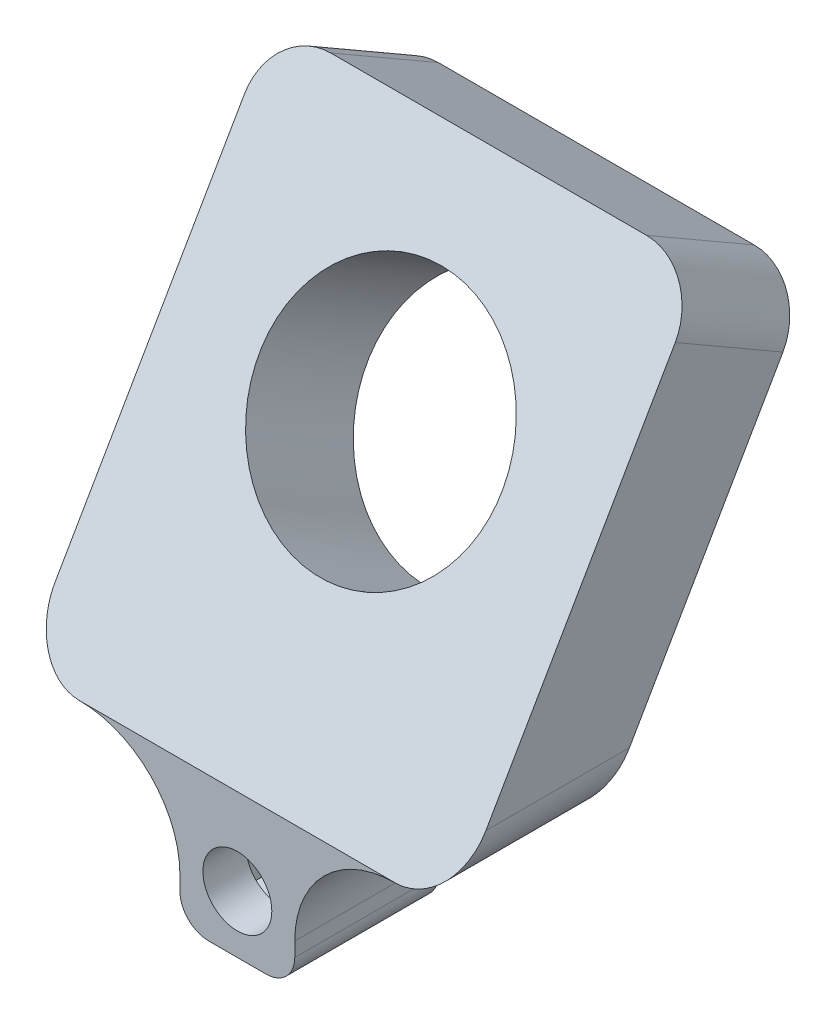
ISO-10303-21;
HEADER;
FILE_DESCRIPTION(('STEP AP214'),'2;1');
FILE_NAME('part.step','',(''),(''),'','','');
FILE_SCHEMA(('AUTOMOTIVE_DESIGN { 1 0 10303 214 1 1 1 1 }'));
ENDSEC;
DATA;
#1=APPLICATION_CONTEXT('core data for automotive mechanical design processes');
#2=APPLICATION_PROTOCOL_DEFINITION('international standard','automotive_design',2000,#1);
#3=PRODUCT_CONTEXT('',#1,'mechanical');
#4=PRODUCT('Part','Part','',(#3));
#5=PRODUCT_RELATED_PRODUCT_CATEGORY('part','',(#4));
#6=PRODUCT_DEFINITION_FORMATION('','',#4);
#7=PRODUCT_DEFINITION_CONTEXT('part definition',#1,'design');
#8=PRODUCT_DEFINITION('design','',#6,#7);
#9=PRODUCT_DEFINITION_SHAPE('','',#8);
#10=(LENGTH_UNIT() NAMED_UNIT(*) SI_UNIT(.MILLI.,.METRE.));
#11=(NAMED_UNIT(*) PLANE_ANGLE_UNIT() SI_UNIT($,.RADIAN.));
#12=(NAMED_UNIT(*) SI_UNIT($,.STERADIAN.) SOLID_ANGLE_UNIT());
#13=UNCERTAINTY_MEASURE_WITH_UNIT(LENGTH_MEASURE(1.E-05),#10,'distance_accuracy_value','');
#14=(GEOMETRIC_REPRESENTATION_CONTEXT(3) GLOBAL_UNCERTAINTY_ASSIGNED_CONTEXT((#13)) GLOBAL_UNIT_ASSIGNED_CONTEXT((#10,
#11,#12)) REPRESENTATION_CONTEXT('',''));
#15=CARTESIAN_POINT('',(0.,0.,0.));
#16=DIRECTION('',(0.,0.,1.));
#17=DIRECTION('',(1.,0.,0.));
#18=AXIS2_PLACEMENT_3D('',#15,#16,#17);
#19=CARTESIAN_POINT('',(2.,-2.5,2.5));
#20=DIRECTION('',(-1.,0.,0.));
#21=DIRECTION('',(0.,0.,1.));
#22=AXIS2_PLACEMENT_3D('',#19,#20,#21);
#23=PLANE('',#22);
#24=DIRECTION('',(0.,1.,0.));
#25=VECTOR('',#24,1.);
#26=CARTESIAN_POINT('',(2.,-2.5,2.5));
#27=LINE('',#26,#25);
#28=CARTESIAN_POINT('',(2.,-1.5,2.5));
#29=VERTEX_POINT('',#28);
#30=CARTESIAN_POINT('',(2.,-1.,2.5));
#31=VERTEX_POINT('',#30);
#32=EDGE_CURVE('E226',#29,#31,#27,.T.);
#33=ORIENTED_EDGE('',*,*,#32,.F.);
#34=DIRECTION('',(0.,0.,-1.));
#35=VECTOR('',#34,1.);
#36=CARTESIAN_POINT('',(2.,-1.5,2.5));
#37=LINE('',#36,#35);
#38=CARTESIAN_POINT('',(2.,-1.5,-2.5));
#39=VERTEX_POINT('',#38);
#40=EDGE_CURVE('E333',#29,#39,#37,.T.);
#41=ORIENTED_EDGE('',*,*,#40,.T.);
#42=DIRECTION('',(0.,1.,0.));
#43=VECTOR('',#42,1.);
#44=CARTESIAN_POINT('',(2.,-2.5,-2.5));
#45=LINE('',#44,#43);
#46=CARTESIAN_POINT('',(2.,-1.,-2.5));
#47=VERTEX_POINT('',#46);
#48=EDGE_CURVE('E220',#39,#47,#45,.T.);
#49=ORIENTED_EDGE('',*,*,#48,.T.);
#50=DIRECTION('',(0.,0.,-1.));
#51=VECTOR('',#50,1.);
#52=CARTESIAN_POINT('',(2.,-1.,2.5));
#53=LINE('',#52,#51);
#54=EDGE_CURVE('E261',#47,#31,#53,.F.);
#55=ORIENTED_EDGE('',*,*,#54,.T.);
#56=EDGE_LOOP('',(#33,#41,#49,#55));
#57=FACE_BOUND('',#56,.T.);
#58=ADVANCED_FACE('F40',(#57),#23,.F.);
#59=CARTESIAN_POINT('',(-2.,-2.5,2.5));
#60=DIRECTION('',(1.,0.,0.));
#61=DIRECTION('',(0.,0.,-1.));
#62=AXIS2_PLACEMENT_3D('',#59,#60,#61);
#63=PLANE('',#62);
#64=DIRECTION('',(0.,-1.,0.));
#65=VECTOR('',#64,1.);
#66=CARTESIAN_POINT('',(-2.,-2.5,-2.5));
#67=LINE('',#66,#65);
#68=CARTESIAN_POINT('',(-2.,-1.,-2.5));
#69=VERTEX_POINT('',#68);
#70=CARTESIAN_POINT('',(-2.,-1.5,-2.5));
#71=VERTEX_POINT('',#70);
#72=EDGE_CURVE('E247',#69,#71,#67,.T.);
#73=ORIENTED_EDGE('',*,*,#72,.T.);
#74=DIRECTION('',(0.,0.,-1.));
#75=VECTOR('',#74,1.);
#76=CARTESIAN_POINT('',(-2.,-1.5,2.5));
#77=LINE('',#76,#75);
#78=CARTESIAN_POINT('',(-2.,-1.5,2.5));
#79=VERTEX_POINT('',#78);
#80=EDGE_CURVE('E11',#71,#79,#77,.F.);
#81=ORIENTED_EDGE('',*,*,#80,.T.);
#82=DIRECTION('',(0.,-1.,0.));
#83=VECTOR('',#82,1.);
#84=CARTESIAN_POINT('',(-2.,-2.5,2.5));
#85=LINE('',#84,#83);
#86=CARTESIAN_POINT('',(-2.,-1.,2.5));
#87=VERTEX_POINT('',#86);
#88=EDGE_CURVE('E234',#87,#79,#85,.T.);
#89=ORIENTED_EDGE('',*,*,#88,.F.);
#90=DIRECTION('',(0.,0.,-1.));
#91=VECTOR('',#90,1.);
#92=CARTESIAN_POINT('',(-2.,-1.,-2.5));
#93=LINE('',#92,#91);
#94=EDGE_CURVE('E265',#87,#69,#93,.T.);
#95=ORIENTED_EDGE('',*,*,#94,.T.);
#96=EDGE_LOOP('',(#73,#81,#89,#95));
#97=FACE_BOUND('',#96,.T.);
#98=ADVANCED_FACE('F371',(#97),#63,.F.);
#99=CARTESIAN_POINT('',(-2.,-2.5,2.5));
#100=DIRECTION('',(0.,1.,0.));
#101=DIRECTION('',(0.,0.,1.));
#102=AXIS2_PLACEMENT_3D('',#99,#100,#101);
#103=PLANE('',#102);
#104=DIRECTION('',(1.,0.,0.));
#105=VECTOR('',#104,1.);
#106=CARTESIAN_POINT('',(-2.,-2.5,-2.5));
#107=LINE('',#106,#105);
#108=CARTESIAN_POINT('',(-1.,-2.5,-2.5));
#109=VERTEX_POINT('',#108);
#110=CARTESIAN_POINT('',(1.,-2.5,-2.5));
#111=VERTEX_POINT('',#110);
#112=EDGE_CURVE('E230',#109,#111,#107,.T.);
#113=ORIENTED_EDGE('',*,*,#112,.T.);
#114=DIRECTION('',(0.,0.,-1.));
#115=VECTOR('',#114,1.);
#116=CARTESIAN_POINT('',(1.,-2.5,2.5));
#117=LINE('',#116,#115);
#118=CARTESIAN_POINT('',(1.,-2.5,2.5));
#119=VERTEX_POINT('',#118);
#120=EDGE_CURVE('E62',#111,#119,#117,.F.);
#121=ORIENTED_EDGE('',*,*,#120,.T.);
#122=DIRECTION('',(1.,0.,0.));
#123=VECTOR('',#122,1.);
#124=CARTESIAN_POINT('',(-2.,-2.5,2.5));
#125=LINE('',#124,#123);
#126=CARTESIAN_POINT('',(-1.,-2.5,2.5));
#127=VERTEX_POINT('',#126);
#128=EDGE_CURVE('E237',#127,#119,#125,.T.);
#129=ORIENTED_EDGE('',*,*,#128,.F.);
#130=DIRECTION('',(0.,0.,-1.));
#131=VECTOR('',#130,1.);
#132=CARTESIAN_POINT('',(-1.,-2.5,2.5));
#133=LINE('',#132,#131);
#134=EDGE_CURVE('E343',#127,#109,#133,.T.);
#135=ORIENTED_EDGE('',*,*,#134,.T.);
#136=EDGE_LOOP('',(#113,#121,#129,#135));
#137=FACE_BOUND('',#136,.T.);
#138=ADVANCED_FACE('F366',(#137),#103,.F.);
#139=CARTESIAN_POINT('',(0.,0.,2.5));
#140=DIRECTION('',(0.,0.,-1.));
#141=DIRECTION('',(-1.,0.,0.));
#142=AXIS2_PLACEMENT_3D('',#139,#140,#141);
#143=PLANE('',#142);
#144=CARTESIAN_POINT('',(0.,-0.5,2.5));
#145=DIRECTION('',(0.,0.,1.));
#146=DIRECTION('',(1.,0.,0.));
#147=AXIS2_PLACEMENT_3D('',#144,#145,#146);
#148=CIRCLE('',#147,1.2);
#149=CARTESIAN_POINT('',(1.2,-0.5,2.5));
#150=VERTEX_POINT('',#149);
#151=EDGE_CURVE('E648',#150,#150,#148,.T.);
#152=ORIENTED_EDGE('',*,*,#151,.F.);
#153=EDGE_LOOP('',(#152));
#154=FACE_BOUND('',#153,.T.);
#155=ORIENTED_EDGE('',*,*,#128,.T.);
#156=CARTESIAN_POINT('',(1.,-1.5,2.5));
#157=DIRECTION('',(0.,0.,-1.));
#158=DIRECTION('',(-1.,0.,0.));
#159=AXIS2_PLACEMENT_3D('',#156,#157,#158);
#160=CIRCLE('',#159,1.);
#161=EDGE_CURVE('E49',#119,#29,#160,.F.);
#162=ORIENTED_EDGE('',*,*,#161,.T.);
#163=ORIENTED_EDGE('',*,*,#32,.T.);
#164=CARTESIAN_POINT('',(5.5,-1.,2.5));
#165=DIRECTION('',(0.,0.,-1.));
#166=DIRECTION('',(-1.,0.,0.));
#167=AXIS2_PLACEMENT_3D('',#164,#165,#166);
#168=CIRCLE('',#167,3.5);
#169=CARTESIAN_POINT('',(5.5,2.5,2.5));
#170=VERTEX_POINT('',#169);
#171=EDGE_CURVE('E277',#31,#170,#168,.T.);
#172=ORIENTED_EDGE('',*,*,#171,.T.);
#173=DIRECTION('',(-1.,0.,0.));
#174=VECTOR('',#173,1.);
#175=CARTESIAN_POINT('',(-2.,2.5,2.5));
#176=LINE('',#175,#174);
#177=CARTESIAN_POINT('',(-5.5,2.5,2.5));
#178=VERTEX_POINT('',#177);
#179=EDGE_CURVE('E229',#170,#178,#176,.T.);
#180=ORIENTED_EDGE('',*,*,#179,.T.);
#181=CARTESIAN_POINT('',(-5.5,-1.,2.5));
#182=DIRECTION('',(0.,0.,-1.));
#183=DIRECTION('',(-1.,0.,0.));
#184=AXIS2_PLACEMENT_3D('',#181,#182,#183);
#185=CIRCLE('',#184,3.5);
#186=EDGE_CURVE('E285',#178,#87,#185,.T.);
#187=ORIENTED_EDGE('',*,*,#186,.T.);
#188=ORIENTED_EDGE('',*,*,#88,.T.);
#189=CARTESIAN_POINT('',(-1.,-1.5,2.5));
#190=DIRECTION('',(0.,0.,-1.));
#191=DIRECTION('',(-1.,0.,0.));
#192=AXIS2_PLACEMENT_3D('',#189,#190,#191);
#193=CIRCLE('',#192,1.);
#194=EDGE_CURVE('E349',#79,#127,#193,.F.);
#195=ORIENTED_EDGE('',*,*,#194,.T.);
#196=EDGE_LOOP('',(#155,#162,#163,#172,#180,#187,#188,#195));
#197=FACE_BOUND('',#196,.T.);
#198=ADVANCED_FACE('F355',(#154,#197),#143,.F.);
#199=CARTESIAN_POINT('',(0.,0.,-2.5));
#200=DIRECTION('',(0.,0.,-1.));
#201=DIRECTION('',(-1.,0.,0.));
#202=AXIS2_PLACEMENT_3D('',#199,#200,#201);
#203=PLANE('',#202);
#204=DIRECTION('',(0.,1.,0.));
#205=VECTOR('',#204,1.);
#206=CARTESIAN_POINT('',(-1.5,-2.,-2.5));
#207=LINE('',#206,#205);
#208=CARTESIAN_POINT('',(-1.5,-2.,-2.5));
#209=VERTEX_POINT('',#208);
#210=CARTESIAN_POINT('',(-1.5,1.,-2.5));
#211=VERTEX_POINT('',#210);
#212=EDGE_CURVE('E175',#209,#211,#207,.T.);
#213=ORIENTED_EDGE('',*,*,#212,.F.);
#214=DIRECTION('',(-1.,0.,0.));
#215=VECTOR('',#214,1.);
#216=CARTESIAN_POINT('',(1.5,-2.,-2.5));
#217=LINE('',#216,#215);
#218=CARTESIAN_POINT('',(1.5,-2.,-2.5));
#219=VERTEX_POINT('',#218);
#220=EDGE_CURVE('E195',#219,#209,#217,.T.);
#221=ORIENTED_EDGE('',*,*,#220,.F.);
#222=DIRECTION('',(0.,-1.,0.));
#223=VECTOR('',#222,1.);
#224=CARTESIAN_POINT('',(1.5,-2.,-2.5));
#225=LINE('',#224,#223);
#226=CARTESIAN_POINT('',(1.5,1.,-2.5));
#227=VERTEX_POINT('',#226);
#228=EDGE_CURVE('E199',#227,#219,#225,.T.);
#229=ORIENTED_EDGE('',*,*,#228,.F.);
#230=DIRECTION('',(1.,0.,0.));
#231=VECTOR('',#230,1.);
#232=CARTESIAN_POINT('',(1.5,1.,-2.5));
#233=LINE('',#232,#231);
#234=EDGE_CURVE('E211',#211,#227,#233,.T.);
#235=ORIENTED_EDGE('',*,*,#234,.F.);
#236=EDGE_LOOP('',(#213,#221,#229,#235));
#237=FACE_BOUND('',#236,.T.);
#238=ORIENTED_EDGE('',*,*,#48,.F.);
#239=CARTESIAN_POINT('',(1.,-1.5,-2.5));
#240=DIRECTION('',(0.,0.,-1.));
#241=DIRECTION('',(-1.,0.,0.));
#242=AXIS2_PLACEMENT_3D('',#239,#240,#241);
#243=CIRCLE('',#242,1.);
#244=EDGE_CURVE('E340',#39,#111,#243,.T.);
#245=ORIENTED_EDGE('',*,*,#244,.T.);
#246=ORIENTED_EDGE('',*,*,#112,.F.);
#247=CARTESIAN_POINT('',(-1.,-1.5,-2.5));
#248=DIRECTION('',(0.,0.,-1.));
#249=DIRECTION('',(-1.,0.,0.));
#250=AXIS2_PLACEMENT_3D('',#247,#248,#249);
#251=CIRCLE('',#250,1.);
#252=EDGE_CURVE('E337',#109,#71,#251,.T.);
#253=ORIENTED_EDGE('',*,*,#252,.T.);
#254=ORIENTED_EDGE('',*,*,#72,.F.);
#255=CARTESIAN_POINT('',(-5.5,-1.,-2.5));
#256=DIRECTION('',(0.,0.,-1.));
#257=DIRECTION('',(-1.,0.,0.));
#258=AXIS2_PLACEMENT_3D('',#255,#256,#257);
#259=CIRCLE('',#258,3.5);
#260=CARTESIAN_POINT('',(-5.5,2.5,-2.5));
#261=VERTEX_POINT('',#260);
#262=EDGE_CURVE('E281',#69,#261,#259,.F.);
#263=ORIENTED_EDGE('',*,*,#262,.T.);
#264=DIRECTION('',(-1.,0.,0.));
#265=VECTOR('',#264,1.);
#266=CARTESIAN_POINT('',(-2.,2.5,-2.5));
#267=LINE('',#266,#265);
#268=CARTESIAN_POINT('',(5.5,2.5,-2.5));
#269=VERTEX_POINT('',#268);
#270=EDGE_CURVE('E243',#269,#261,#267,.T.);
#271=ORIENTED_EDGE('',*,*,#270,.F.);
#272=CARTESIAN_POINT('',(5.5,-1.,-2.5));
#273=DIRECTION('',(0.,0.,-1.));
#274=DIRECTION('',(-1.,0.,0.));
#275=AXIS2_PLACEMENT_3D('',#272,#273,#274);
#276=CIRCLE('',#275,3.5);
#277=EDGE_CURVE('E273',#269,#47,#276,.F.);
#278=ORIENTED_EDGE('',*,*,#277,.T.);
#279=EDGE_LOOP('',(#238,#245,#246,#253,#254,#263,#271,#278));
#280=FACE_BOUND('',#279,.T.);
#281=ADVANCED_FACE('F365',(#237,#280),#203,.T.);
#282=CARTESIAN_POINT('',(-1.5,-2.,1.));
#283=DIRECTION('',(-1.,0.,0.));
#284=DIRECTION('',(0.,0.,1.));
#285=AXIS2_PLACEMENT_3D('',#282,#283,#284);
#286=PLANE('',#285);
#287=ORIENTED_EDGE('',*,*,#212,.T.);
#288=DIRECTION('',(0.,0.,-1.));
#289=VECTOR('',#288,1.);
#290=CARTESIAN_POINT('',(-1.5,1.,1.));
#291=LINE('',#290,#289);
#292=CARTESIAN_POINT('',(-1.5,1.,1.));
#293=VERTEX_POINT('',#292);
#294=EDGE_CURVE('E168',#293,#211,#291,.T.);
#295=ORIENTED_EDGE('',*,*,#294,.F.);
#296=DIRECTION('',(0.,1.,0.));
#297=VECTOR('',#296,1.);
#298=CARTESIAN_POINT('',(-1.5,-2.,1.));
#299=LINE('',#298,#297);
#300=CARTESIAN_POINT('',(-1.5,-2.,1.));
#301=VERTEX_POINT('',#300);
#302=EDGE_CURVE('E172',#301,#293,#299,.T.);
#303=ORIENTED_EDGE('',*,*,#302,.F.);
#304=DIRECTION('',(0.,0.,-1.));
#305=VECTOR('',#304,1.);
#306=CARTESIAN_POINT('',(-1.5,-2.,1.));
#307=LINE('',#306,#305);
#308=EDGE_CURVE('E217',#301,#209,#307,.T.);
#309=ORIENTED_EDGE('',*,*,#308,.T.);
#310=EDGE_LOOP('',(#287,#295,#303,#309));
#311=FACE_BOUND('',#310,.T.);
#312=ADVANCED_FACE('F170',(#311),#286,.F.);
#313=CARTESIAN_POINT('',(1.5,-2.,1.));
#314=DIRECTION('',(0.,-1.,0.));
#315=DIRECTION('',(0.,0.,-1.));
#316=AXIS2_PLACEMENT_3D('',#313,#314,#315);
#317=PLANE('',#316);
#318=ORIENTED_EDGE('',*,*,#220,.T.);
#319=ORIENTED_EDGE('',*,*,#308,.F.);
#320=DIRECTION('',(-1.,0.,0.));
#321=VECTOR('',#320,1.);
#322=CARTESIAN_POINT('',(1.5,-2.,1.));
#323=LINE('',#322,#321);
#324=CARTESIAN_POINT('',(1.5,-2.,1.));
#325=VERTEX_POINT('',#324);
#326=EDGE_CURVE('E181',#325,#301,#323,.T.);
#327=ORIENTED_EDGE('',*,*,#326,.F.);
#328=DIRECTION('',(0.,0.,-1.));
#329=VECTOR('',#328,1.);
#330=CARTESIAN_POINT('',(1.5,-2.,1.));
#331=LINE('',#330,#329);
#332=EDGE_CURVE('E221',#325,#219,#331,.T.);
#333=ORIENTED_EDGE('',*,*,#332,.T.);
#334=EDGE_LOOP('',(#318,#319,#327,#333));
#335=FACE_BOUND('',#334,.T.);
#336=ADVANCED_FACE('F543',(#335),#317,.F.);
#337=CARTESIAN_POINT('',(1.5,-2.,1.));
#338=DIRECTION('',(1.,0.,0.));
#339=DIRECTION('',(0.,0.,-1.));
#340=AXIS2_PLACEMENT_3D('',#337,#338,#339);
#341=PLANE('',#340);
#342=ORIENTED_EDGE('',*,*,#228,.T.);
#343=ORIENTED_EDGE('',*,*,#332,.F.);
#344=DIRECTION('',(0.,-1.,0.));
#345=VECTOR('',#344,1.);
#346=CARTESIAN_POINT('',(1.5,-2.,1.));
#347=LINE('',#346,#345);
#348=CARTESIAN_POINT('',(1.5,1.,1.));
#349=VERTEX_POINT('',#348);
#350=EDGE_CURVE('E190',#349,#325,#347,.T.);
#351=ORIENTED_EDGE('',*,*,#350,.F.);
#352=DIRECTION('',(0.,0.,-1.));
#353=VECTOR('',#352,1.);
#354=CARTESIAN_POINT('',(1.5,1.,1.));
#355=LINE('',#354,#353);
#356=EDGE_CURVE('E180',#349,#227,#355,.T.);
#357=ORIENTED_EDGE('',*,*,#356,.T.);
#358=EDGE_LOOP('',(#342,#343,#351,#357));
#359=FACE_BOUND('',#358,.T.);
#360=ADVANCED_FACE('F551',(#359),#341,.F.);
#361=CARTESIAN_POINT('',(1.5,1.,1.));
#362=DIRECTION('',(0.,1.,0.));
#363=DIRECTION('',(0.,0.,1.));
#364=AXIS2_PLACEMENT_3D('',#361,#362,#363);
#365=PLANE('',#364);
#366=ORIENTED_EDGE('',*,*,#234,.T.);
#367=ORIENTED_EDGE('',*,*,#356,.F.);
#368=DIRECTION('',(1.,0.,0.));
#369=VECTOR('',#368,1.);
#370=CARTESIAN_POINT('',(1.5,1.,1.));
#371=LINE('',#370,#369);
#372=EDGE_CURVE('E184',#293,#349,#371,.T.);
#373=ORIENTED_EDGE('',*,*,#372,.F.);
#374=ORIENTED_EDGE('',*,*,#294,.T.);
#375=EDGE_LOOP('',(#366,#367,#373,#374));
#376=FACE_BOUND('',#375,.T.);
#377=ADVANCED_FACE('F185',(#376),#365,.F.);
#378=CARTESIAN_POINT('',(0.,0.,1.));
#379=DIRECTION('',(0.,0.,1.));
#380=DIRECTION('',(1.,0.,0.));
#381=AXIS2_PLACEMENT_3D('',#378,#379,#380);
#382=PLANE('',#381);
#383=CARTESIAN_POINT('',(0.,-0.5,1.));
#384=DIRECTION('',(0.,0.,1.));
#385=DIRECTION('',(1.,0.,0.));
#386=AXIS2_PLACEMENT_3D('',#383,#384,#385);
#387=CIRCLE('',#386,1.2);
#388=CARTESIAN_POINT('',(1.2,-0.5,1.));
#389=VERTEX_POINT('',#388);
#390=EDGE_CURVE('E651',#389,#389,#387,.T.);
#391=ORIENTED_EDGE('',*,*,#390,.T.);
#392=EDGE_LOOP('',(#391));
#393=FACE_BOUND('',#392,.T.);
#394=ORIENTED_EDGE('',*,*,#302,.T.);
#395=ORIENTED_EDGE('',*,*,#372,.T.);
#396=ORIENTED_EDGE('',*,*,#350,.T.);
#397=ORIENTED_EDGE('',*,*,#326,.T.);
#398=EDGE_LOOP('',(#394,#395,#396,#397));
#399=FACE_BOUND('',#398,.T.);
#400=ADVANCED_FACE('F192',(#393,#399),#382,.F.);
#401=CARTESIAN_POINT('',(7.5,15.4903810567665,-10.0000000000001));
#402=DIRECTION('',(0.,0.500000000000004,0.866025403784436));
#403=DIRECTION('',(0.,-0.866025403784436,0.500000000000004));
#404=AXIS2_PLACEMENT_3D('',#401,#402,#403);
#405=PLANE('',#404);
#406=CARTESIAN_POINT('',(0.,8.99519052838328,-6.25000000000003));
#407=DIRECTION('',(0.,-0.500000000000004,-0.866025403784436));
#408=DIRECTION('',(0.,0.866025403784436,-0.500000000000004));
#409=AXIS2_PLACEMENT_3D('',#406,#407,#408);
#410=CIRCLE('',#409,4.2164);
#411=CARTESIAN_POINT('',(0.,12.6467000409,-8.35820000000004));
#412=VERTEX_POINT('',#411);
#413=EDGE_CURVE('E257',#412,#412,#410,.T.);
#414=ORIENTED_EDGE('',*,*,#413,.F.);
#415=EDGE_LOOP('',(#414));
#416=FACE_BOUND('',#415,.T.);
#417=DIRECTION('',(0.,0.866025403784436,-0.500000000000004));
#418=VECTOR('',#417,1.);
#419=CARTESIAN_POINT('',(-7.5,15.4903810567665,-10.0000000000001));
#420=LINE('',#419,#418);
#421=CARTESIAN_POINT('',(-7.5,4.5,-3.65470053837926));
#422=VERTEX_POINT('',#421);
#423=CARTESIAN_POINT('',(-7.5,13.7583302491977,-9.00000000000005));
#424=VERTEX_POINT('',#423);
#425=EDGE_CURVE('E256',#422,#424,#420,.T.);
#426=ORIENTED_EDGE('',*,*,#425,.T.);
#427=CARTESIAN_POINT('',(-5.5,13.7583302491977,-9.00000000000005));
#428=DIRECTION('',(0.,0.500000000000004,0.866025403784436));
#429=DIRECTION('',(0.,-0.866025403784436,0.500000000000004));
#430=AXIS2_PLACEMENT_3D('',#427,#428,#429);
#431=CIRCLE('',#430,2.);
#432=CARTESIAN_POINT('',(-5.5,15.4903810567665,-10.0000000000001));
#433=VERTEX_POINT('',#432);
#434=EDGE_CURVE('E322',#424,#433,#431,.F.);
#435=ORIENTED_EDGE('',*,*,#434,.T.);
#436=DIRECTION('',(-1.,0.,0.));
#437=VECTOR('',#436,1.);
#438=CARTESIAN_POINT('',(7.5,15.4903810567665,-10.0000000000001));
#439=LINE('',#438,#437);
#440=CARTESIAN_POINT('',(5.5,15.4903810567665,-10.0000000000001));
#441=VERTEX_POINT('',#440);
#442=EDGE_CURVE('E202',#441,#433,#439,.T.);
#443=ORIENTED_EDGE('',*,*,#442,.F.);
#444=CARTESIAN_POINT('',(5.5,13.7583302491977,-9.00000000000005));
#445=DIRECTION('',(0.,0.500000000000004,0.866025403784436));
#446=DIRECTION('',(0.,-0.866025403784436,0.500000000000004));
#447=AXIS2_PLACEMENT_3D('',#444,#445,#446);
#448=CIRCLE('',#447,2.);
#449=CARTESIAN_POINT('',(7.5,13.7583302491977,-9.00000000000005));
#450=VERTEX_POINT('',#449);
#451=EDGE_CURVE('E319',#441,#450,#448,.F.);
#452=ORIENTED_EDGE('',*,*,#451,.T.);
#453=DIRECTION('',(0.,0.866025403784436,-0.500000000000004));
#454=VECTOR('',#453,1.);
#455=CARTESIAN_POINT('',(7.5,15.4903810567665,-10.0000000000001));
#456=LINE('',#455,#454);
#457=CARTESIAN_POINT('',(7.5,4.5,-3.65470053837926));
#458=VERTEX_POINT('',#457);
#459=EDGE_CURVE('E400',#458,#450,#456,.T.);
#460=ORIENTED_EDGE('',*,*,#459,.F.);
#461=CARTESIAN_POINT('',(5.5,4.5,-3.65470053837926));
#462=DIRECTION('',(0.,0.500000000000004,0.866025403784436));
#463=DIRECTION('',(0.,0.866025403784436,-0.500000000000004));
#464=AXIS2_PLACEMENT_3D('',#461,#462,#463);
#465=ELLIPSE('',#464,2.30940107675851,2.);
#466=EDGE_CURVE('E316',#458,#269,#465,.F.);
#467=ORIENTED_EDGE('',*,*,#466,.T.);
#468=ORIENTED_EDGE('',*,*,#270,.T.);
#469=CARTESIAN_POINT('',(-5.5,4.5,-3.65470053837926));
#470=DIRECTION('',(0.,0.500000000000004,0.866025403784436));
#471=DIRECTION('',(0.,-0.866025403784436,0.500000000000004));
#472=AXIS2_PLACEMENT_3D('',#469,#470,#471);
#473=ELLIPSE('',#472,2.30940107675851,2.);
#474=EDGE_CURVE('E313',#261,#422,#473,.F.);
#475=ORIENTED_EDGE('',*,*,#474,.T.);
#476=EDGE_LOOP('',(#426,#435,#443,#452,#460,#467,#468,#475));
#477=FACE_BOUND('',#476,.T.);
#478=ADVANCED_FACE('F421',(#416,#477),#405,.F.);
#479=CARTESIAN_POINT('',(7.5,17.6554445662277,-6.25000000000008));
#480=DIRECTION('',(0.,-0.866025403784436,0.500000000000004));
#481=DIRECTION('',(0.,-0.500000000000004,-0.866025403784436));
#482=AXIS2_PLACEMENT_3D('',#479,#480,#481);
#483=PLANE('',#482);
#484=ORIENTED_EDGE('',*,*,#442,.T.);
#485=DIRECTION('',(0.,0.500000000000004,0.866025403784436));
#486=VECTOR('',#485,1.);
#487=CARTESIAN_POINT('',(-5.5,17.6554445662277,-6.25000000000008));
#488=LINE('',#487,#486);
#489=CARTESIAN_POINT('',(-5.5,17.6554445662277,-6.25000000000008));
#490=VERTEX_POINT('',#489);
#491=EDGE_CURVE('E291',#433,#490,#488,.T.);
#492=ORIENTED_EDGE('',*,*,#491,.T.);
#493=DIRECTION('',(-1.,0.,0.));
#494=VECTOR('',#493,1.);
#495=CARTESIAN_POINT('',(7.5,17.6554445662277,-6.25000000000008));
#496=LINE('',#495,#494);
#497=CARTESIAN_POINT('',(5.5,17.6554445662277,-6.25000000000008));
#498=VERTEX_POINT('',#497);
#499=EDGE_CURVE('E399',#498,#490,#496,.T.);
#500=ORIENTED_EDGE('',*,*,#499,.F.);
#501=DIRECTION('',(0.,0.500000000000004,0.866025403784436));
#502=VECTOR('',#501,1.);
#503=CARTESIAN_POINT('',(5.5,17.6554445662277,-6.25000000000008));
#504=LINE('',#503,#502);
#505=EDGE_CURVE('E288',#498,#441,#504,.F.);
#506=ORIENTED_EDGE('',*,*,#505,.T.);
#507=EDGE_LOOP('',(#484,#492,#500,#506));
#508=FACE_BOUND('',#507,.T.);
#509=ADVANCED_FACE('F431',(#508),#483,.F.);
#510=CARTESIAN_POINT('',(7.5,2.5,2.5));
#511=DIRECTION('',(0.,-0.500000000000004,-0.866025403784436));
#512=DIRECTION('',(0.,0.866025403784436,-0.500000000000004));
#513=AXIS2_PLACEMENT_3D('',#510,#511,#512);
#514=PLANE('',#513);
#515=CARTESIAN_POINT('',(0.,11.1602540378444,-2.50000000000005));
#516=DIRECTION('',(0.,-0.500000000000004,-0.866025403784436));
#517=DIRECTION('',(0.,0.866025403784436,-0.500000000000004));
#518=AXIS2_PLACEMENT_3D('',#515,#516,#517);
#519=CIRCLE('',#518,4.2164);
#520=CARTESIAN_POINT('',(0.,14.8117635503611,-4.60820000000007));
#521=VERTEX_POINT('',#520);
#522=EDGE_CURVE('E252',#521,#521,#519,.T.);
#523=ORIENTED_EDGE('',*,*,#522,.T.);
#524=EDGE_LOOP('',(#523));
#525=FACE_BOUND('',#524,.T.);
#526=ORIENTED_EDGE('',*,*,#499,.T.);
#527=CARTESIAN_POINT('',(-5.5,15.9233937586588,-5.25000000000007));
#528=DIRECTION('',(0.,-0.500000000000004,-0.866025403784436));
#529=DIRECTION('',(0.,0.866025403784436,-0.500000000000004));
#530=AXIS2_PLACEMENT_3D('',#527,#528,#529);
#531=CIRCLE('',#530,2.);
#532=CARTESIAN_POINT('',(-7.5,15.9233937586588,-5.25000000000007));
#533=VERTEX_POINT('',#532);
#534=EDGE_CURVE('E304',#490,#533,#531,.F.);
#535=ORIENTED_EDGE('',*,*,#534,.T.);
#536=DIRECTION('',(0.,-0.866025403784436,0.500000000000004));
#537=VECTOR('',#536,1.);
#538=CARTESIAN_POINT('',(-7.5,2.5,2.5));
#539=LINE('',#538,#537);
#540=CARTESIAN_POINT('',(-7.5,4.5,1.34529946162074));
#541=VERTEX_POINT('',#540);
#542=EDGE_CURVE('E404',#533,#541,#539,.T.);
#543=ORIENTED_EDGE('',*,*,#542,.T.);
#544=CARTESIAN_POINT('',(-5.5,4.5,1.34529946162074));
#545=DIRECTION('',(0.,-0.500000000000004,-0.866025403784436));
#546=DIRECTION('',(0.,-0.866025403784436,0.500000000000004));
#547=AXIS2_PLACEMENT_3D('',#544,#545,#546);
#548=ELLIPSE('',#547,2.30940107675851,2.);
#549=EDGE_CURVE('E295',#541,#178,#548,.F.);
#550=ORIENTED_EDGE('',*,*,#549,.T.);
#551=ORIENTED_EDGE('',*,*,#179,.F.);
#552=CARTESIAN_POINT('',(5.5,4.5,1.34529946162074));
#553=DIRECTION('',(0.,-0.500000000000004,-0.866025403784436));
#554=DIRECTION('',(0.,0.866025403784436,-0.500000000000004));
#555=AXIS2_PLACEMENT_3D('',#552,#553,#554);
#556=ELLIPSE('',#555,2.30940107675851,2.);
#557=CARTESIAN_POINT('',(7.5,4.5,1.34529946162074));
#558=VERTEX_POINT('',#557);
#559=EDGE_CURVE('E298',#170,#558,#556,.F.);
#560=ORIENTED_EDGE('',*,*,#559,.T.);
#561=DIRECTION('',(0.,-0.866025403784436,0.500000000000004));
#562=VECTOR('',#561,1.);
#563=CARTESIAN_POINT('',(7.5,2.5,2.5));
#564=LINE('',#563,#562);
#565=CARTESIAN_POINT('',(7.5,15.9233937586588,-5.25000000000007));
#566=VERTEX_POINT('',#565);
#567=EDGE_CURVE('E392',#566,#558,#564,.T.);
#568=ORIENTED_EDGE('',*,*,#567,.F.);
#569=CARTESIAN_POINT('',(5.5,15.9233937586588,-5.25000000000007));
#570=DIRECTION('',(0.,-0.500000000000004,-0.866025403784436));
#571=DIRECTION('',(0.,0.866025403784436,-0.500000000000004));
#572=AXIS2_PLACEMENT_3D('',#569,#570,#571);
#573=CIRCLE('',#572,2.);
#574=EDGE_CURVE('E301',#566,#498,#573,.F.);
#575=ORIENTED_EDGE('',*,*,#574,.T.);
#576=EDGE_LOOP('',(#526,#535,#543,#550,#551,#560,#568,#575));
#577=FACE_BOUND('',#576,.T.);
#578=ADVANCED_FACE('F391',(#525,#577),#514,.F.);
#579=CARTESIAN_POINT('',(7.5,0.,0.));
#580=DIRECTION('',(-1.,0.,0.));
#581=DIRECTION('',(0.,0.,1.));
#582=AXIS2_PLACEMENT_3D('',#579,#580,#581);
#583=PLANE('',#582);
#584=ORIENTED_EDGE('',*,*,#459,.T.);
#585=DIRECTION('',(0.,0.500000000000004,0.866025403784436));
#586=VECTOR('',#585,1.);
#587=CARTESIAN_POINT('',(7.5,14.2158620039282,-8.20753175473061));
#588=LINE('',#587,#586);
#589=EDGE_CURVE('E329',#450,#566,#588,.T.);
#590=ORIENTED_EDGE('',*,*,#589,.T.);
#591=ORIENTED_EDGE('',*,*,#567,.T.);
#592=DIRECTION('',(0.,0.,-1.));
#593=VECTOR('',#592,1.);
#594=CARTESIAN_POINT('',(7.5,4.5,0.));
#595=LINE('',#594,#593);
#596=EDGE_CURVE('E325',#558,#458,#595,.T.);
#597=ORIENTED_EDGE('',*,*,#596,.T.);
#598=EDGE_LOOP('',(#584,#590,#591,#597));
#599=FACE_BOUND('',#598,.T.);
#600=ADVANCED_FACE('F395',(#599),#583,.F.);
#601=CARTESIAN_POINT('',(-7.5,0.,0.));
#602=DIRECTION('',(-1.,0.,0.));
#603=DIRECTION('',(0.,0.,1.));
#604=AXIS2_PLACEMENT_3D('',#601,#602,#603);
#605=PLANE('',#604);
#606=ORIENTED_EDGE('',*,*,#542,.F.);
#607=DIRECTION('',(0.,0.500000000000004,0.866025403784436));
#608=VECTOR('',#607,1.);
#609=CARTESIAN_POINT('',(-7.5,13.7583302491977,-9.00000000000005));
#610=LINE('',#609,#608);
#611=EDGE_CURVE('E310',#533,#424,#610,.F.);
#612=ORIENTED_EDGE('',*,*,#611,.T.);
#613=ORIENTED_EDGE('',*,*,#425,.F.);
#614=DIRECTION('',(0.,0.,-1.));
#615=VECTOR('',#614,1.);
#616=CARTESIAN_POINT('',(-7.5,4.5,2.5));
#617=LINE('',#616,#615);
#618=EDGE_CURVE('E307',#422,#541,#617,.F.);
#619=ORIENTED_EDGE('',*,*,#618,.T.);
#620=EDGE_LOOP('',(#606,#612,#613,#619));
#621=FACE_BOUND('',#620,.T.);
#622=ADVANCED_FACE('F423',(#621),#605,.T.);
#623=CARTESIAN_POINT('',(0.,8.99519052838328,-6.25000000000003));
#624=DIRECTION('',(0.,-0.500000000000004,-0.866025403784436));
#625=DIRECTION('',(0.,0.866025403784436,-0.500000000000004));
#626=AXIS2_PLACEMENT_3D('',#623,#624,#625);
#627=CYLINDRICAL_SURFACE('',#626,4.2164);
#628=ORIENTED_EDGE('',*,*,#413,.T.);
#629=EDGE_LOOP('',(#628));
#630=FACE_BOUND('',#629,.T.);
#631=ORIENTED_EDGE('',*,*,#522,.F.);
#632=EDGE_LOOP('',(#631));
#633=FACE_BOUND('',#632,.T.);
#634=ADVANCED_FACE('F614',(#630,#633),#627,.F.);
#635=CARTESIAN_POINT('',(0.,-0.5,2.5));
#636=DIRECTION('',(0.,0.,1.));
#637=DIRECTION('',(1.,0.,0.));
#638=AXIS2_PLACEMENT_3D('',#635,#636,#637);
#639=CYLINDRICAL_SURFACE('',#638,1.2);
#640=ORIENTED_EDGE('',*,*,#151,.T.);
#641=EDGE_LOOP('',(#640));
#642=FACE_BOUND('',#641,.T.);
#643=ORIENTED_EDGE('',*,*,#390,.F.);
#644=EDGE_LOOP('',(#643));
#645=FACE_BOUND('',#644,.T.);
#646=ADVANCED_FACE('F456',(#642,#645),#639,.F.);
#647=CARTESIAN_POINT('',(5.5,-1.,-2.5));
#648=DIRECTION('',(0.,0.,1.));
#649=DIRECTION('',(1.,0.,0.));
#650=AXIS2_PLACEMENT_3D('',#647,#648,#649);
#651=CYLINDRICAL_SURFACE('',#650,3.5);
#652=ORIENTED_EDGE('',*,*,#171,.F.);
#653=ORIENTED_EDGE('',*,*,#54,.F.);
#654=ORIENTED_EDGE('',*,*,#277,.F.);
#655=DIRECTION('',(0.,0.,-1.));
#656=VECTOR('',#655,1.);
#657=CARTESIAN_POINT('',(5.5,2.5,-2.5));
#658=LINE('',#657,#656);
#659=EDGE_CURVE('E240',#170,#269,#658,.T.);
#660=ORIENTED_EDGE('',*,*,#659,.F.);
#661=EDGE_LOOP('',(#652,#653,#654,#660));
#662=FACE_BOUND('',#661,.T.);
#663=ADVANCED_FACE('F382',(#662),#651,.F.);
#664=CARTESIAN_POINT('',(-5.5,-1.,2.5));
#665=DIRECTION('',(0.,0.,1.));
#666=DIRECTION('',(1.,0.,0.));
#667=AXIS2_PLACEMENT_3D('',#664,#665,#666);
#668=CYLINDRICAL_SURFACE('',#667,3.5);
#669=ORIENTED_EDGE('',*,*,#186,.F.);
#670=DIRECTION('',(0.,0.,-1.));
#671=VECTOR('',#670,1.);
#672=CARTESIAN_POINT('',(-5.5,2.5,2.5));
#673=LINE('',#672,#671);
#674=EDGE_CURVE('E269',#261,#178,#673,.F.);
#675=ORIENTED_EDGE('',*,*,#674,.F.);
#676=ORIENTED_EDGE('',*,*,#262,.F.);
#677=ORIENTED_EDGE('',*,*,#94,.F.);
#678=EDGE_LOOP('',(#669,#675,#676,#677));
#679=FACE_BOUND('',#678,.T.);
#680=ADVANCED_FACE('F375',(#679),#668,.F.);
#681=CARTESIAN_POINT('',(-5.5,15.9233937586588,-5.25000000000007));
#682=DIRECTION('',(0.,-0.500000000000004,-0.866025403784436));
#683=DIRECTION('',(0.,0.866025403784436,-0.500000000000004));
#684=AXIS2_PLACEMENT_3D('',#681,#682,#683);
#685=CYLINDRICAL_SURFACE('',#684,2.);
#686=ORIENTED_EDGE('',*,*,#434,.F.);
#687=ORIENTED_EDGE('',*,*,#611,.F.);
#688=ORIENTED_EDGE('',*,*,#534,.F.);
#689=ORIENTED_EDGE('',*,*,#491,.F.);
#690=EDGE_LOOP('',(#686,#687,#688,#689));
#691=FACE_BOUND('',#690,.T.);
#692=ADVANCED_FACE('F425',(#691),#685,.T.);
#693=CARTESIAN_POINT('',(5.5,14.2158620039282,-8.20753175473061));
#694=DIRECTION('',(0.,0.500000000000004,0.866025403784436));
#695=DIRECTION('',(0.,-0.866025403784436,0.500000000000004));
#696=AXIS2_PLACEMENT_3D('',#693,#694,#695);
#697=CYLINDRICAL_SURFACE('',#696,2.);
#698=ORIENTED_EDGE('',*,*,#451,.F.);
#699=ORIENTED_EDGE('',*,*,#505,.F.);
#700=ORIENTED_EDGE('',*,*,#574,.F.);
#701=ORIENTED_EDGE('',*,*,#589,.F.);
#702=EDGE_LOOP('',(#698,#699,#700,#701));
#703=FACE_BOUND('',#702,.T.);
#704=ADVANCED_FACE('F436',(#703),#697,.T.);
#705=CARTESIAN_POINT('',(5.5,4.5,0.));
#706=DIRECTION('',(0.,0.,-1.));
#707=DIRECTION('',(-1.,0.,0.));
#708=AXIS2_PLACEMENT_3D('',#705,#706,#707);
#709=CYLINDRICAL_SURFACE('',#708,2.);
#710=ORIENTED_EDGE('',*,*,#559,.F.);
#711=ORIENTED_EDGE('',*,*,#659,.T.);
#712=ORIENTED_EDGE('',*,*,#466,.F.);
#713=ORIENTED_EDGE('',*,*,#596,.F.);
#714=EDGE_LOOP('',(#710,#711,#712,#713));
#715=FACE_BOUND('',#714,.T.);
#716=ADVANCED_FACE('F385',(#715),#709,.T.);
#717=CARTESIAN_POINT('',(-5.5,4.5,-2.5));
#718=DIRECTION('',(0.,0.,1.));
#719=DIRECTION('',(1.,0.,0.));
#720=AXIS2_PLACEMENT_3D('',#717,#718,#719);
#721=CYLINDRICAL_SURFACE('',#720,2.);
#722=ORIENTED_EDGE('',*,*,#549,.F.);
#723=ORIENTED_EDGE('',*,*,#618,.F.);
#724=ORIENTED_EDGE('',*,*,#474,.F.);
#725=ORIENTED_EDGE('',*,*,#674,.T.);
#726=EDGE_LOOP('',(#722,#723,#724,#725));
#727=FACE_BOUND('',#726,.T.);
#728=ADVANCED_FACE('F419',(#727),#721,.T.);
#729=CARTESIAN_POINT('',(1.,-1.5,2.5));
#730=DIRECTION('',(0.,0.,-1.));
#731=DIRECTION('',(-1.,0.,0.));
#732=AXIS2_PLACEMENT_3D('',#729,#730,#731);
#733=CYLINDRICAL_SURFACE('',#732,1.);
#734=ORIENTED_EDGE('',*,*,#161,.F.);
#735=ORIENTED_EDGE('',*,*,#120,.F.);
#736=ORIENTED_EDGE('',*,*,#244,.F.);
#737=ORIENTED_EDGE('',*,*,#40,.F.);
#738=EDGE_LOOP('',(#734,#735,#736,#737));
#739=FACE_BOUND('',#738,.T.);
#740=ADVANCED_FACE('F362',(#739),#733,.T.);
#741=CARTESIAN_POINT('',(-1.,-1.5,2.5));
#742=DIRECTION('',(0.,0.,-1.));
#743=DIRECTION('',(-1.,0.,0.));
#744=AXIS2_PLACEMENT_3D('',#741,#742,#743);
#745=CYLINDRICAL_SURFACE('',#744,1.);
#746=ORIENTED_EDGE('',*,*,#194,.F.);
#747=ORIENTED_EDGE('',*,*,#80,.F.);
#748=ORIENTED_EDGE('',*,*,#252,.F.);
#749=ORIENTED_EDGE('',*,*,#134,.F.);
#750=EDGE_LOOP('',(#746,#747,#748,#749));
#751=FACE_BOUND('',#750,.T.);
#752=ADVANCED_FACE('F42',(#751),#745,.T.);
#753=CLOSED_SHELL('',(#58,#98,#138,#198,#281,#312,#336,#360,#377,#400,#478,#509,#578,#600,#622,
#634,#646,#663,#680,#692,#704,#716,#728,#740,#752));
#754=MANIFOLD_SOLID_BREP('B2',#753);
#755=ADVANCED_BREP_SHAPE_REPRESENTATION('',(#18,#754),#14);
#756=SHAPE_DEFINITION_REPRESENTATION(#9,#755);
ENDSEC;
END-ISO-10303-21;
